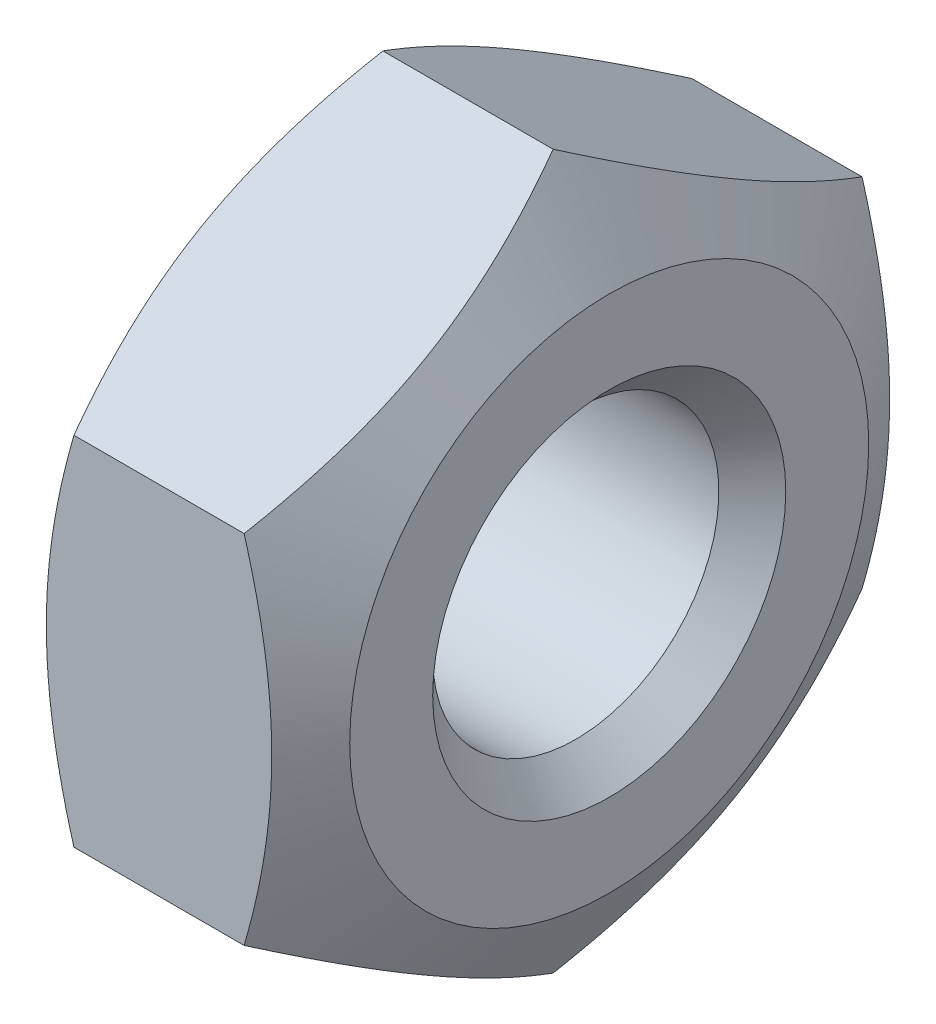
ISO-10303-21;
HEADER;
FILE_DESCRIPTION(('STEP AP214'),'2;1');
FILE_NAME('part.step','',(''),(''),'','','');
FILE_SCHEMA(('AUTOMOTIVE_DESIGN { 1 0 10303 214 1 1 1 1 }'));
ENDSEC;
DATA;
#1=APPLICATION_CONTEXT('core data for automotive mechanical design processes');
#2=APPLICATION_PROTOCOL_DEFINITION('international standard','automotive_design',2000,#1);
#3=PRODUCT_CONTEXT('',#1,'mechanical');
#4=PRODUCT('Part','Part','',(#3));
#5=PRODUCT_RELATED_PRODUCT_CATEGORY('part','',(#4));
#6=PRODUCT_DEFINITION_FORMATION('','',#4);
#7=PRODUCT_DEFINITION_CONTEXT('part definition',#1,'design');
#8=PRODUCT_DEFINITION('design','',#6,#7);
#9=PRODUCT_DEFINITION_SHAPE('','',#8);
#10=(LENGTH_UNIT() NAMED_UNIT(*) SI_UNIT(.MILLI.,.METRE.));
#11=(NAMED_UNIT(*) PLANE_ANGLE_UNIT() SI_UNIT($,.RADIAN.));
#12=(NAMED_UNIT(*) SI_UNIT($,.STERADIAN.) SOLID_ANGLE_UNIT());
#13=UNCERTAINTY_MEASURE_WITH_UNIT(LENGTH_MEASURE(1.E-05),#10,'distance_accuracy_value','');
#14=(GEOMETRIC_REPRESENTATION_CONTEXT(3) GLOBAL_UNCERTAINTY_ASSIGNED_CONTEXT((#13)) GLOBAL_UNIT_ASSIGNED_CONTEXT((#10,
#11,#12)) REPRESENTATION_CONTEXT('',''));
#15=CARTESIAN_POINT('',(0.,0.,0.));
#16=DIRECTION('',(0.,0.,1.));
#17=DIRECTION('',(1.,0.,0.));
#18=AXIS2_PLACEMENT_3D('',#15,#16,#17);
#19=CARTESIAN_POINT('',(1.6,-2.93999985741188,2.94000022592335));
#20=DIRECTION('',(1.,0.,0.));
#21=DIRECTION('',(0.,0.,-1.));
#22=AXIS2_PLACEMENT_3D('',#19,#20,#21);
#23=PLANE('',#22);
#24=CARTESIAN_POINT('',(1.6,0.,0.));
#25=DIRECTION('',(1.,0.,0.));
#26=DIRECTION('',(0.,-1.42189080011314E-07,0.99999999999999));
#27=AXIS2_PLACEMENT_3D('',#24,#25,#26);
#28=CIRCLE('',#27,2.94);
#29=CARTESIAN_POINT('',(1.6,-4.18035895233263E-07,2.93999999999997));
#30=VERTEX_POINT('',#29);
#31=EDGE_CURVE('E344',#30,#30,#28,.T.);
#32=ORIENTED_EDGE('',*,*,#31,.T.);
#33=EDGE_LOOP('',(#32));
#34=FACE_BOUND('',#33,.T.);
#35=CARTESIAN_POINT('',(1.6,0.,0.));
#36=DIRECTION('',(-1.,0.,0.));
#37=DIRECTION('',(0.,0.,-1.));
#38=AXIS2_PLACEMENT_3D('',#35,#36,#37);
#39=CIRCLE('',#38,2.);
#40=CARTESIAN_POINT('',(1.6,0.,-2.));
#41=VERTEX_POINT('',#40);
#42=EDGE_CURVE('E347',#41,#41,#39,.F.);
#43=ORIENTED_EDGE('',*,*,#42,.F.);
#44=EDGE_LOOP('',(#43));
#45=FACE_BOUND('',#44,.T.);
#46=ADVANCED_FACE('F17',(#34,#45),#23,.T.);
#47=CARTESIAN_POINT('',(-1.6,-2.94,2.94));
#48=DIRECTION('',(-1.,0.,0.));
#49=DIRECTION('',(0.,1.,0.));
#50=AXIS2_PLACEMENT_3D('',#47,#48,#49);
#51=PLANE('',#50);
#52=CARTESIAN_POINT('',(-1.6,0.,0.));
#53=DIRECTION('',(-1.,0.,0.));
#54=DIRECTION('',(0.,0.,-1.));
#55=AXIS2_PLACEMENT_3D('',#52,#53,#54);
#56=CIRCLE('',#55,2.94);
#57=CARTESIAN_POINT('',(-1.6,0.,-2.94));
#58=VERTEX_POINT('',#57);
#59=EDGE_CURVE('E123',#58,#58,#56,.F.);
#60=ORIENTED_EDGE('',*,*,#59,.F.);
#61=EDGE_LOOP('',(#60));
#62=FACE_BOUND('',#61,.T.);
#63=CARTESIAN_POINT('',(-1.6,0.,0.));
#64=DIRECTION('',(1.,0.,0.));
#65=DIRECTION('',(0.,-1.42053899088171E-07,0.99999999999999));
#66=AXIS2_PLACEMENT_3D('',#63,#64,#65);
#67=CIRCLE('',#66,2.);
#68=CARTESIAN_POINT('',(-1.6,-2.84107798176342E-07,1.99999999999998));
#69=VERTEX_POINT('',#68);
#70=EDGE_CURVE('E120',#69,#69,#67,.T.);
#71=ORIENTED_EDGE('',*,*,#70,.T.);
#72=EDGE_LOOP('',(#71));
#73=FACE_BOUND('',#72,.T.);
#74=ADVANCED_FACE('F143',(#62,#73),#51,.T.);
#75=CARTESIAN_POINT('',(-1.27694150348773,2.02072591369914,3.50000004930208));
#76=DIRECTION('',(0.,0.866025403784438,0.5));
#77=DIRECTION('',(1.,0.,0.));
#78=AXIS2_PLACEMENT_3D('',#75,#76,#77);
#79=PLANE('',#78);
#80=DIRECTION('',(-1.,3.08626736090294E-13,-5.35029782043099E-13));
#81=VECTOR('',#80,1.);
#82=CARTESIAN_POINT('',(0.964076458082609,4.0414518843277,-5.16031661845773E-13));
#83=LINE('',#82,#81);
#84=CARTESIAN_POINT('',(0.964076458082609,4.0414518843277,-5.16031661845773E-13));
#85=VERTEX_POINT('',#84);
#86=CARTESIAN_POINT('',(-0.964076458082708,4.04145188432829,-1.54765089632747E-12));
#87=VERTEX_POINT('',#86);
#88=EDGE_CURVE('E102',#85,#87,#83,.T.);
#89=ORIENTED_EDGE('',*,*,#88,.T.);
#90=CARTESIAN_POINT('',(-0.964076458082707,4.04145188432829,-1.54737334057131E-12));
#91=CARTESIAN_POINT('',(-1.17188881303672,3.68151031673617,0.623437082823993));
#92=CARTESIAN_POINT('',(-1.27636824905493,3.35729252272324,1.18499877477229));
#93=CARTESIAN_POINT('',(-1.27694150348773,2.70786401984908,2.30984193763372));
#94=CARTESIAN_POINT('',(-1.17303532190232,2.38265331098785,2.87312340854686));
#95=CARTESIAN_POINT('',(-0.964076441649104,2.02072591369914,3.50000004930208));
#96=B_SPLINE_CURVE_WITH_KNOTS('',3,(#90,#91,#92,#93,#94,#95),.UNSPECIFIED.,.F.,.F.,(4,2,4),(0.,
0.5,1.),.UNSPECIFIED.);
#97=CARTESIAN_POINT('',(-0.964076441649104,2.02072591369914,3.50000004930208));
#98=VERTEX_POINT('',#97);
#99=EDGE_CURVE('E88',#87,#98,#96,.T.);
#100=ORIENTED_EDGE('',*,*,#99,.T.);
#101=DIRECTION('',(1.,1.32514876015398E-08,-2.29522499153225E-08));
#102=VECTOR('',#101,1.);
#103=CARTESIAN_POINT('',(-0.964076441649104,2.02072591369914,3.50000004930208));
#104=LINE('',#103,#102);
#105=CARTESIAN_POINT('',(0.964076461446099,2.02072593925003,3.50000000504663));
#106=VERTEX_POINT('',#105);
#107=EDGE_CURVE('E101',#106,#98,#104,.F.);
#108=ORIENTED_EDGE('',*,*,#107,.F.);
#109=CARTESIAN_POINT('',(0.964076461446099,2.02072593925003,3.50000000504663));
#110=CARTESIAN_POINT('',(1.17188881878174,2.38066750218616,2.8765629302855));
#111=CARTESIAN_POINT('',(1.27636825687009,2.70488529215206,2.31500124534688));
#112=CARTESIAN_POINT('',(1.27694151544975,3.35431378691931,1.19015809652702));
#113=CARTESIAN_POINT('',(1.17303533594105,3.67952449172066,0.626876632645801));
#114=CARTESIAN_POINT('',(0.964076458082609,4.0414518843277,-5.160802341031E-13));
#115=B_SPLINE_CURVE_WITH_KNOTS('',3,(#109,#110,#111,#112,#113,#114),.UNSPECIFIED.,.F.,.F.,(4,2,
4),(0.,0.5,1.),.UNSPECIFIED.);
#116=EDGE_CURVE('E118',#106,#85,#115,.T.);
#117=ORIENTED_EDGE('',*,*,#116,.T.);
#118=EDGE_LOOP('',(#89,#100,#108,#117));
#119=FACE_BOUND('',#118,.T.);
#120=ADVANCED_FACE('F117',(#119),#79,.T.);
#121=CARTESIAN_POINT('',(-1.27694151544981,4.04145188432784,7.73863982658786E-13));
#122=DIRECTION('',(0.,0.866025403784438,-0.5));
#123=DIRECTION('',(1.,0.,0.));
#124=AXIS2_PLACEMENT_3D('',#121,#122,#123);
#125=PLANE('',#124);
#126=DIRECTION('',(-1.,-1.51128616247108E-09,-2.61762456713553E-09));
#127=VECTOR('',#126,1.);
#128=CARTESIAN_POINT('',(0.964076458084088,2.02072594216402,-3.49999999999945));
#129=LINE('',#128,#127);
#130=CARTESIAN_POINT('',(0.964076458084088,2.02072594216402,-3.49999999999945));
#131=VERTEX_POINT('',#130);
#132=CARTESIAN_POINT('',(-0.9640764614461,2.02072593925003,-3.50000000504663));
#133=VERTEX_POINT('',#132);
#134=EDGE_CURVE('E112',#131,#133,#129,.T.);
#135=ORIENTED_EDGE('',*,*,#134,.T.);
#136=CARTESIAN_POINT('',(-0.9640764614461,2.02072593925003,-3.50000000504663));
#137=CARTESIAN_POINT('',(-1.17188881878176,2.380667502186,-2.87656293028578));
#138=CARTESIAN_POINT('',(-1.27636825687013,2.70488529215175,-2.3150012453474));
#139=CARTESIAN_POINT('',(-1.27694151544981,3.35431378691873,-1.19015809652802));
#140=CARTESIAN_POINT('',(-1.17303533594113,3.67952449171994,-0.626876632647041));
#141=CARTESIAN_POINT('',(-0.964076458082708,4.04145188432681,-1.00420394310011E-12));
#142=B_SPLINE_CURVE_WITH_KNOTS('',3,(#136,#137,#138,#139,#140,#141),.UNSPECIFIED.,.F.,.F.,(4,2,
4),(0.,0.5,1.),.UNSPECIFIED.);
#143=EDGE_CURVE('E93',#133,#87,#142,.T.);
#144=ORIENTED_EDGE('',*,*,#143,.T.);
#145=ORIENTED_EDGE('',*,*,#88,.F.);
#146=CARTESIAN_POINT('',(0.96407645808261,4.04145188432784,7.73863982658786E-13));
#147=CARTESIAN_POINT('',(1.17188881603142,3.68151032192267,-0.623437073840706));
#148=CARTESIAN_POINT('',(1.27636825465274,3.35729253241829,-1.18499875797996));
#149=CARTESIAN_POINT('',(1.27694151430002,2.70786403857553,-2.30984190519854));
#150=CARTESIAN_POINT('',(1.17303533532598,2.38265333423717,-2.87312336827786));
#151=CARTESIAN_POINT('',(0.964076458084088,2.02072594216402,-3.49999999999945));
#152=B_SPLINE_CURVE_WITH_KNOTS('',3,(#146,#147,#148,#149,#150,#151),.UNSPECIFIED.,.F.,.F.,(4,2,
4),(0.,0.5,1.),.UNSPECIFIED.);
#153=EDGE_CURVE('E113',#85,#131,#152,.T.);
#154=ORIENTED_EDGE('',*,*,#153,.T.);
#155=EDGE_LOOP('',(#135,#144,#145,#154));
#156=FACE_BOUND('',#155,.T.);
#157=ADVANCED_FACE('F109',(#156),#125,.T.);
#158=CARTESIAN_POINT('',(-1.27683977149324,-2.0207259421631,-3.5));
#159=DIRECTION('',(0.,0.,-1.));
#160=DIRECTION('',(0.,1.,0.));
#161=AXIS2_PLACEMENT_3D('',#158,#159,#160);
#162=PLANE('',#161);
#163=DIRECTION('',(-1.,-1.07637173754483E-08,0.));
#164=VECTOR('',#163,1.);
#165=CARTESIAN_POINT('',(0.964076464073687,-2.02072592140901,-3.5));
#166=LINE('',#165,#164);
#167=CARTESIAN_POINT('',(0.964076464073687,-2.02072592140901,-3.5));
#168=VERTEX_POINT('',#167);
#169=CARTESIAN_POINT('',(-0.964076458084279,-2.0207259421631,-3.5));
#170=VERTEX_POINT('',#169);
#171=EDGE_CURVE('E312',#168,#170,#166,.T.);
#172=ORIENTED_EDGE('',*,*,#171,.T.);
#173=CARTESIAN_POINT('',(-0.964076458084279,-2.0207259421631,-3.5));
#174=CARTESIAN_POINT('',(-1.15503068409207,-1.35926282073002,-3.5));
#175=CARTESIAN_POINT('',(-1.27683977149324,-0.696747019638569,-3.5));
#176=CARTESIAN_POINT('',(-1.27669111430608,-3.68993811200591E-09,-3.5));
#177=B_SPLINE_CURVE_WITH_KNOTS('',3,(#173,#174,#175,#176),.UNSPECIFIED.,.F.,.F.,(4,4),(0.,1.),.UNSPECIFIED.);
#178=CARTESIAN_POINT('',(-1.27669046349226,-3.68993799744013E-09,-3.49999693276271));
#179=VERTEX_POINT('',#178);
#180=EDGE_CURVE('E309',#170,#179,#177,.T.);
#181=ORIENTED_EDGE('',*,*,#180,.T.);
#182=CARTESIAN_POINT('',(-1.27669111430608,-3.68993811200591E-09,-3.5));
#183=CARTESIAN_POINT('',(-1.27653024958867,0.697510464739735,-3.5));
#184=CARTESIAN_POINT('',(-1.1554673470424,1.35775023641084,-3.5));
#185=CARTESIAN_POINT('',(-0.9640764614461,2.02072593488059,-3.5));
#186=B_SPLINE_CURVE_WITH_KNOTS('',3,(#182,#183,#184,#185),.UNSPECIFIED.,.F.,.F.,(4,4),(0.,1.),.UNSPECIFIED.);
#187=EDGE_CURVE('E299',#179,#133,#186,.T.);
#188=ORIENTED_EDGE('',*,*,#187,.T.);
#189=ORIENTED_EDGE('',*,*,#134,.F.);
#190=CARTESIAN_POINT('',(0.964076458084087,2.02072594216424,-3.5));
#191=CARTESIAN_POINT('',(1.15503068692171,1.35926282073293,-3.5));
#192=CARTESIAN_POINT('',(1.27683977700865,0.696747019642948,-3.5));
#193=CARTESIAN_POINT('',(1.27669112253501,3.69627982735321E-09,-3.5));
#194=B_SPLINE_CURVE_WITH_KNOTS('',3,(#190,#191,#192,#193),.UNSPECIFIED.,.F.,.F.,(4,4),(0.,1.),.UNSPECIFIED.);
#195=CARTESIAN_POINT('',(1.27669047069258,3.69627947936451E-09,-3.49999692979335));
#196=VERTEX_POINT('',#195);
#197=EDGE_CURVE('E289',#131,#196,#194,.T.);
#198=ORIENTED_EDGE('',*,*,#197,.T.);
#199=CARTESIAN_POINT('',(1.27669112253501,3.69627982735321E-09,-3.5));
#200=CARTESIAN_POINT('',(1.27653025597082,-0.697510460290615,-3.5));
#201=CARTESIAN_POINT('',(1.15546735160262,-1.3577502275824,-3.5));
#202=CARTESIAN_POINT('',(0.964076464073687,-2.02072592140901,-3.5));
#203=B_SPLINE_CURVE_WITH_KNOTS('',3,(#199,#200,#201,#202),.UNSPECIFIED.,.F.,.F.,(4,4),(0.,1.),.UNSPECIFIED.);
#204=EDGE_CURVE('E267',#196,#168,#203,.T.);
#205=ORIENTED_EDGE('',*,*,#204,.T.);
#206=EDGE_LOOP('',(#172,#181,#188,#189,#198,#205));
#207=FACE_BOUND('',#206,.T.);
#208=ADVANCED_FACE('F247',(#207),#162,.T.);
#209=CARTESIAN_POINT('',(-1.27694151430018,-2.02072593697423,-3.50000000898844));
#210=DIRECTION('',(0.,-0.866025403784438,-0.5));
#211=DIRECTION('',(1.,0.,0.));
#212=AXIS2_PLACEMENT_3D('',#209,#210,#211);
#213=PLANE('',#212);
#214=DIRECTION('',(-1.,-3.08166099170756E-13,5.34338826663792E-13));
#215=VECTOR('',#214,1.);
#216=CARTESIAN_POINT('',(0.96407645808261,-4.0414518843277,5.16919840265473E-13));
#217=LINE('',#216,#215);
#218=CARTESIAN_POINT('',(0.96407645808261,-4.0414518843277,5.16919840265473E-13));
#219=VERTEX_POINT('',#218);
#220=CARTESIAN_POINT('',(-0.964076458082707,-4.04145188432829,1.54720680711762E-12));
#221=VERTEX_POINT('',#220);
#222=EDGE_CURVE('E265',#219,#221,#217,.T.);
#223=ORIENTED_EDGE('',*,*,#222,.T.);
#224=CARTESIAN_POINT('',(-0.964076458082707,-4.04145188432829,1.54737334057131E-12));
#225=CARTESIAN_POINT('',(-1.17188881603153,-3.68151032192292,-0.623437073840289));
#226=CARTESIAN_POINT('',(-1.27636825465287,-3.35729253241836,-1.18499875797986));
#227=CARTESIAN_POINT('',(-1.27694151430018,-2.70786403857524,-2.30984190519907));
#228=CARTESIAN_POINT('',(-1.17303533532616,-2.38265333423669,-2.8731233682787));
#229=CARTESIAN_POINT('',(-0.964076458084279,-2.02072594216333,-3.50000000000065));
#230=B_SPLINE_CURVE_WITH_KNOTS('',3,(#224,#225,#226,#227,#228,#229),.UNSPECIFIED.,.F.,.F.,(4,2,
4),(0.,0.5,1.),.UNSPECIFIED.);
#231=EDGE_CURVE('E215',#221,#170,#230,.T.);
#232=ORIENTED_EDGE('',*,*,#231,.T.);
#233=ORIENTED_EDGE('',*,*,#171,.F.);
#234=CARTESIAN_POINT('',(0.964076464073688,-2.02072593697423,-3.50000000898844));
#235=CARTESIAN_POINT('',(1.17188882093053,-2.38066750032506,-2.87656293350903));
#236=CARTESIAN_POINT('',(1.27636825860269,-2.70488529065141,-2.31500124794607));
#237=CARTESIAN_POINT('',(1.27694151634867,-3.35431378614073,-1.19015809787557));
#238=CARTESIAN_POINT('',(1.17303533642248,-3.67952449130368,-0.626876633368036));
#239=CARTESIAN_POINT('',(0.96407645808261,-4.0414518843277,5.17381276710083E-13));
#240=B_SPLINE_CURVE_WITH_KNOTS('',3,(#234,#235,#236,#237,#238,#239),.UNSPECIFIED.,.F.,.F.,(4,2,
4),(0.,0.5,1.),.UNSPECIFIED.);
#241=EDGE_CURVE('E212',#168,#219,#240,.T.);
#242=ORIENTED_EDGE('',*,*,#241,.T.);
#243=EDGE_LOOP('',(#223,#232,#233,#242));
#244=FACE_BOUND('',#243,.T.);
#245=ADVANCED_FACE('F239',(#244),#213,.T.);
#246=CARTESIAN_POINT('',(-1.27694151544981,-4.04145188432784,-7.74031638423594E-13));
#247=DIRECTION('',(0.,-0.866025403784438,0.5));
#248=DIRECTION('',(1.,0.,0.));
#249=AXIS2_PLACEMENT_3D('',#246,#247,#248);
#250=PLANE('',#249);
#251=DIRECTION('',(-1.,-5.87074776779138E-09,-1.01684333492359E-08));
#252=VECTOR('',#251,1.);
#253=CARTESIAN_POINT('',(0.964076449866262,-2.02072592793033,3.50000002465292));
#254=LINE('',#253,#252);
#255=CARTESIAN_POINT('',(0.964076449866262,-2.02072592793033,3.50000002465292));
#256=VERTEX_POINT('',#255);
#257=CARTESIAN_POINT('',(-0.964076461446101,-2.02072593925003,3.50000000504663));
#258=VERTEX_POINT('',#257);
#259=EDGE_CURVE('E201',#256,#258,#254,.T.);
#260=ORIENTED_EDGE('',*,*,#259,.T.);
#261=CARTESIAN_POINT('',(-0.964076461446101,-2.02072593925003,3.50000000504663));
#262=CARTESIAN_POINT('',(-1.17188881878176,-2.380667502186,2.87656293028578));
#263=CARTESIAN_POINT('',(-1.27636825687013,-2.70488529215175,2.3150012453474));
#264=CARTESIAN_POINT('',(-1.27694151544981,-3.35431378691873,1.19015809652802));
#265=CARTESIAN_POINT('',(-1.17303533594113,-3.67952449171994,0.626876632647039));
#266=CARTESIAN_POINT('',(-0.964076458082707,-4.04145188432681,1.00409630196254E-12));
#267=B_SPLINE_CURVE_WITH_KNOTS('',3,(#261,#262,#263,#264,#265,#266),.UNSPECIFIED.,.F.,.F.,(4,2,
4),(0.,0.5,1.),.UNSPECIFIED.);
#268=EDGE_CURVE('E207',#258,#221,#267,.T.);
#269=ORIENTED_EDGE('',*,*,#268,.T.);
#270=ORIENTED_EDGE('',*,*,#222,.F.);
#271=CARTESIAN_POINT('',(0.96407645808261,-4.04145188432784,-7.74031638423594E-13));
#272=CARTESIAN_POINT('',(1.17188881453397,-3.68151031932901,0.623437078333058));
#273=CARTESIAN_POINT('',(1.27636825185369,-3.35729252757019,1.18499876637711));
#274=CARTESIAN_POINT('',(1.27694150889364,-2.70786402921141,2.30984192141768));
#275=CARTESIAN_POINT('',(1.17303532861387,-2.38265332261145,2.87312338841419));
#276=CARTESIAN_POINT('',(0.964076449866262,-2.02072592793033,3.50000002465293));
#277=B_SPLINE_CURVE_WITH_KNOTS('',3,(#271,#272,#273,#274,#275,#276),.UNSPECIFIED.,.F.,.F.,(4,2,
4),(0.,0.5,1.),.UNSPECIFIED.);
#278=EDGE_CURVE('E210',#219,#256,#277,.T.);
#279=ORIENTED_EDGE('',*,*,#278,.T.);
#280=EDGE_LOOP('',(#260,#269,#270,#279));
#281=FACE_BOUND('',#280,.T.);
#282=ADVANCED_FACE('F180',(#281),#250,.T.);
#283=CARTESIAN_POINT('',(1.27683976878408,-2.02072593488059,3.5));
#284=DIRECTION('',(0.,0.,1.));
#285=DIRECTION('',(0.,1.,0.));
#286=AXIS2_PLACEMENT_3D('',#283,#284,#285);
#287=PLANE('',#286);
#288=ORIENTED_EDGE('',*,*,#107,.T.);
#289=CARTESIAN_POINT('',(-0.964076441649105,2.02072591370003,3.5));
#290=CARTESIAN_POINT('',(-1.15503093683071,1.35926280209878,3.5));
#291=CARTESIAN_POINT('',(-1.27684027966212,0.696747010337093,3.5));
#292=CARTESIAN_POINT('',(-1.2766918804851,3.83430613648539E-09,3.5));
#293=B_SPLINE_CURVE_WITH_KNOTS('',3,(#289,#290,#291,#292),.UNSPECIFIED.,.F.,.F.,(4,4),(0.,1.),.UNSPECIFIED.);
#294=CARTESIAN_POINT('',(-1.2766911338989,3.83430572283183E-09,3.49999665629168));
#295=VERTEX_POINT('',#294);
#296=EDGE_CURVE('E44',#98,#295,#293,.T.);
#297=ORIENTED_EDGE('',*,*,#296,.T.);
#298=CARTESIAN_POINT('',(-1.2766918804851,3.83430613648539E-09,3.5));
#299=CARTESIAN_POINT('',(-1.27653076298713,-0.69751046465025,3.5));
#300=CARTESIAN_POINT('',(-1.15546761125774,-1.35775023636483,3.5));
#301=CARTESIAN_POINT('',(-0.964076461446101,-2.02072593488059,3.5));
#302=B_SPLINE_CURVE_WITH_KNOTS('',3,(#298,#299,#300,#301),.UNSPECIFIED.,.F.,.F.,(4,4),(0.,1.),.UNSPECIFIED.);
#303=EDGE_CURVE('E199',#295,#258,#302,.T.);
#304=ORIENTED_EDGE('',*,*,#303,.T.);
#305=ORIENTED_EDGE('',*,*,#259,.F.);
#306=CARTESIAN_POINT('',(0.964076449866262,-2.02072592793055,3.5));
#307=CARTESIAN_POINT('',(1.15503067870063,-1.35926281139541,3.5));
#308=CARTESIAN_POINT('',(1.27683976878408,-0.696747014950924,3.5));
#309=CARTESIAN_POINT('',(1.27669111430608,-3.69493324825498E-09,3.5));
#310=B_SPLINE_CURVE_WITH_KNOTS('',3,(#306,#307,#308,#309),.UNSPECIFIED.,.F.,.F.,(4,4),(0.,1.),.UNSPECIFIED.);
#311=CARTESIAN_POINT('',(1.27669046349226,-3.69493325652438E-09,3.49999693276272));
#312=VERTEX_POINT('',#311);
#313=EDGE_CURVE('E36',#256,#312,#310,.T.);
#314=ORIENTED_EDGE('',*,*,#313,.T.);
#315=CARTESIAN_POINT('',(1.27669111430608,-3.69493324825498E-09,3.5));
#316=CARTESIAN_POINT('',(1.27653024958982,0.697510464736635,3.5));
#317=CARTESIAN_POINT('',(1.15546734704334,1.35775023640925,3.5));
#318=CARTESIAN_POINT('',(0.964076461446098,2.02072593488059,3.5));
#319=B_SPLINE_CURVE_WITH_KNOTS('',3,(#315,#316,#317,#318),.UNSPECIFIED.,.F.,.F.,(4,4),(0.,1.),.UNSPECIFIED.);
#320=EDGE_CURVE('E159',#312,#106,#319,.T.);
#321=ORIENTED_EDGE('',*,*,#320,.T.);
#322=EDGE_LOOP('',(#288,#297,#304,#305,#314,#321));
#323=FACE_BOUND('',#322,.T.);
#324=ADVANCED_FACE('F158',(#323),#287,.T.);
#325=CARTESIAN_POINT('',(-1.6,0.,0.));
#326=DIRECTION('',(-1.,0.,0.));
#327=DIRECTION('',(0.,0.,-1.));
#328=AXIS2_PLACEMENT_3D('',#325,#326,#327);
#329=CONICAL_SURFACE('',#328,2.,0.785398163397448);
#330=ORIENTED_EDGE('',*,*,#70,.F.);
#331=EDGE_LOOP('',(#330));
#332=FACE_BOUND('',#331,.T.);
#333=CARTESIAN_POINT('',(-1.221,0.,0.));
#334=DIRECTION('',(1.,0.,0.));
#335=DIRECTION('',(0.,0.,1.));
#336=AXIS2_PLACEMENT_3D('',#333,#334,#335);
#337=CIRCLE('',#336,1.621);
#338=CARTESIAN_POINT('',(-1.221,0.,1.621));
#339=VERTEX_POINT('',#338);
#340=EDGE_CURVE('E28',#339,#339,#337,.T.);
#341=ORIENTED_EDGE('',*,*,#340,.T.);
#342=EDGE_LOOP('',(#341));
#343=FACE_BOUND('',#342,.T.);
#344=ADVANCED_FACE('F179',(#332,#343),#329,.F.);
#345=CARTESIAN_POINT('',(1.6,0.,0.));
#346=DIRECTION('',(1.,0.,0.));
#347=DIRECTION('',(0.,0.,1.));
#348=AXIS2_PLACEMENT_3D('',#345,#346,#347);
#349=CYLINDRICAL_SURFACE('',#348,1.621);
#350=CARTESIAN_POINT('',(1.221,0.,0.));
#351=DIRECTION('',(1.,0.,0.));
#352=DIRECTION('',(0.,0.,1.));
#353=AXIS2_PLACEMENT_3D('',#350,#351,#352);
#354=CIRCLE('',#353,1.621);
#355=CARTESIAN_POINT('',(1.221,0.,1.621));
#356=VERTEX_POINT('',#355);
#357=EDGE_CURVE('E11',#356,#356,#354,.T.);
#358=ORIENTED_EDGE('',*,*,#357,.T.);
#359=EDGE_LOOP('',(#358));
#360=FACE_BOUND('',#359,.T.);
#361=ORIENTED_EDGE('',*,*,#340,.F.);
#362=EDGE_LOOP('',(#361));
#363=FACE_BOUND('',#362,.T.);
#364=ADVANCED_FACE('F359',(#360,#363),#349,.F.);
#365=CARTESIAN_POINT('',(1.6,0.,0.));
#366=DIRECTION('',(1.,0.,0.));
#367=DIRECTION('',(0.,0.,1.));
#368=AXIS2_PLACEMENT_3D('',#365,#366,#367);
#369=CONICAL_SURFACE('',#368,2.,0.785398163397447);
#370=ORIENTED_EDGE('',*,*,#42,.T.);
#371=EDGE_LOOP('',(#370));
#372=FACE_BOUND('',#371,.T.);
#373=ORIENTED_EDGE('',*,*,#357,.F.);
#374=EDGE_LOOP('',(#373));
#375=FACE_BOUND('',#374,.T.);
#376=ADVANCED_FACE('F364',(#372,#375),#369,.F.);
#377=CARTESIAN_POINT('',(-0.964076458082708,0.,0.));
#378=DIRECTION('',(1.,0.,0.));
#379=DIRECTION('',(0.,1.09552201788696E-09,1.));
#380=AXIS2_PLACEMENT_3D('',#377,#378,#379);
#381=CONICAL_SURFACE('',#380,4.04145188432991,1.0471975511966);
#382=ORIENTED_EDGE('',*,*,#59,.T.);
#383=EDGE_LOOP('',(#382));
#384=FACE_BOUND('',#383,.T.);
#385=ORIENTED_EDGE('',*,*,#180,.F.);
#386=ORIENTED_EDGE('',*,*,#231,.F.);
#387=ORIENTED_EDGE('',*,*,#268,.F.);
#388=ORIENTED_EDGE('',*,*,#303,.F.);
#389=ORIENTED_EDGE('',*,*,#296,.F.);
#390=ORIENTED_EDGE('',*,*,#99,.F.);
#391=ORIENTED_EDGE('',*,*,#143,.F.);
#392=ORIENTED_EDGE('',*,*,#187,.F.);
#393=EDGE_LOOP('',(#385,#386,#387,#388,#389,#390,#391,#392));
#394=FACE_BOUND('',#393,.T.);
#395=ADVANCED_FACE('F91',(#384,#394),#381,.T.);
#396=CARTESIAN_POINT('',(0.964076449866359,0.,0.));
#397=DIRECTION('',(-1.,0.,0.));
#398=DIRECTION('',(0.,1.05608511969543E-09,-1.));
#399=AXIS2_PLACEMENT_3D('',#396,#397,#398);
#400=CONICAL_SURFACE('',#399,4.04145189856104,1.0471975511966);
#401=ORIENTED_EDGE('',*,*,#31,.F.);
#402=EDGE_LOOP('',(#401));
#403=FACE_BOUND('',#402,.T.);
#404=ORIENTED_EDGE('',*,*,#313,.F.);
#405=ORIENTED_EDGE('',*,*,#278,.F.);
#406=ORIENTED_EDGE('',*,*,#241,.F.);
#407=ORIENTED_EDGE('',*,*,#204,.F.);
#408=ORIENTED_EDGE('',*,*,#197,.F.);
#409=ORIENTED_EDGE('',*,*,#153,.F.);
#410=ORIENTED_EDGE('',*,*,#116,.F.);
#411=ORIENTED_EDGE('',*,*,#320,.F.);
#412=EDGE_LOOP('',(#404,#405,#406,#407,#408,#409,#410,#411));
#413=FACE_BOUND('',#412,.T.);
#414=ADVANCED_FACE('F19',(#403,#413),#400,.T.);
#415=CLOSED_SHELL('',(#46,#74,#120,#157,#208,#245,#282,#324,#344,#364,#376,#395,#414));
#416=MANIFOLD_SOLID_BREP('B1',#415);
#417=ADVANCED_BREP_SHAPE_REPRESENTATION('',(#18,#416),#14);
#418=SHAPE_DEFINITION_REPRESENTATION(#9,#417);
ENDSEC;
END-ISO-10303-21;
